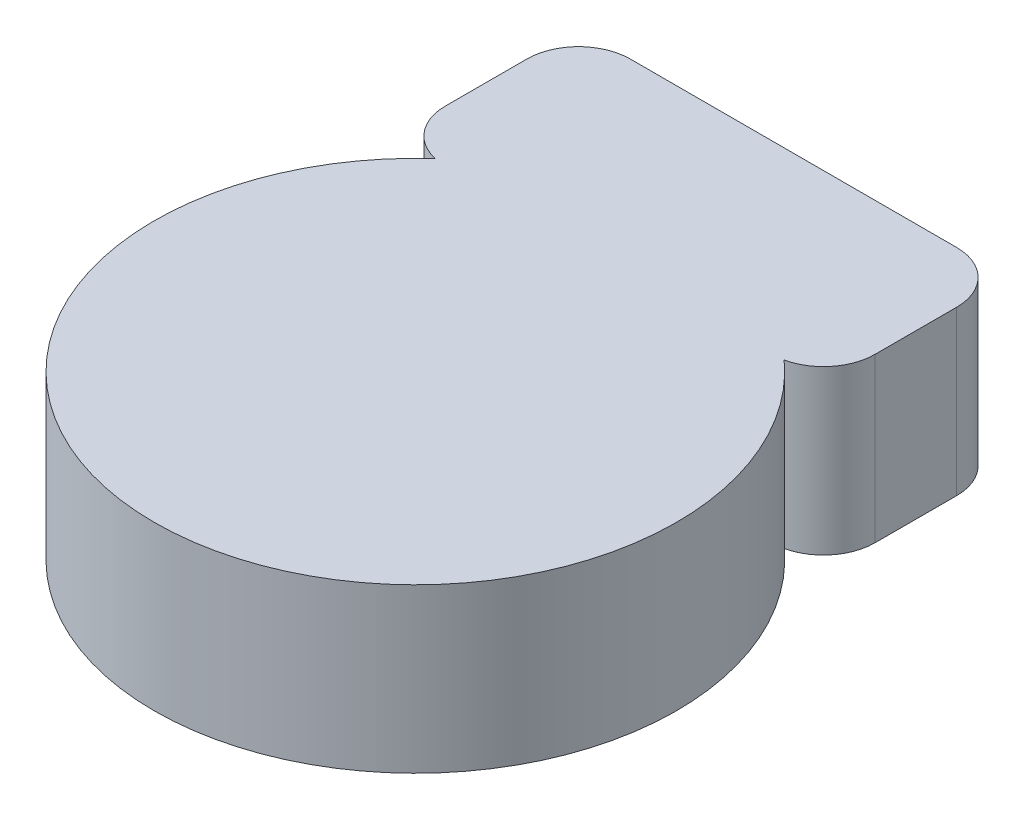
ISO-10303-21;
HEADER;
FILE_DESCRIPTION(('STEP AP214'),'2;1');
FILE_NAME('part.step','',(''),(''),'','','');
FILE_SCHEMA(('AUTOMOTIVE_DESIGN { 1 0 10303 214 1 1 1 1 }'));
ENDSEC;
DATA;
#1=APPLICATION_CONTEXT('core data for automotive mechanical design processes');
#2=APPLICATION_PROTOCOL_DEFINITION('international standard','automotive_design',2000,#1);
#3=PRODUCT_CONTEXT('',#1,'mechanical');
#4=PRODUCT('Part','Part','',(#3));
#5=PRODUCT_RELATED_PRODUCT_CATEGORY('part','',(#4));
#6=PRODUCT_DEFINITION_FORMATION('','',#4);
#7=PRODUCT_DEFINITION_CONTEXT('part definition',#1,'design');
#8=PRODUCT_DEFINITION('design','',#6,#7);
#9=PRODUCT_DEFINITION_SHAPE('','',#8);
#10=(LENGTH_UNIT() NAMED_UNIT(*) SI_UNIT(.MILLI.,.METRE.));
#11=(NAMED_UNIT(*) PLANE_ANGLE_UNIT() SI_UNIT($,.RADIAN.));
#12=(NAMED_UNIT(*) SI_UNIT($,.STERADIAN.) SOLID_ANGLE_UNIT());
#13=UNCERTAINTY_MEASURE_WITH_UNIT(LENGTH_MEASURE(1.E-05),#10,'distance_accuracy_value','');
#14=(GEOMETRIC_REPRESENTATION_CONTEXT(3) GLOBAL_UNCERTAINTY_ASSIGNED_CONTEXT((#13)) GLOBAL_UNIT_ASSIGNED_CONTEXT((#10,
#11,#12)) REPRESENTATION_CONTEXT('',''));
#15=CARTESIAN_POINT('',(0.,0.,0.));
#16=DIRECTION('',(0.,0.,1.));
#17=DIRECTION('',(1.,0.,0.));
#18=AXIS2_PLACEMENT_3D('',#15,#16,#17);
#19=CARTESIAN_POINT('',(-6.,73.4,-9.));
#20=DIRECTION('',(0.,1.,0.));
#21=DIRECTION('',(1.,0.,0.));
#22=AXIS2_PLACEMENT_3D('',#19,#20,#21);
#23=PLANE('',#22);
#24=CARTESIAN_POINT('',(-6.,73.4,-9.));
#25=DIRECTION('',(0.,1.,0.));
#26=DIRECTION('',(0.,0.,1.));
#27=AXIS2_PLACEMENT_3D('',#24,#25,#26);
#28=CIRCLE('',#27,1.9);
#29=CARTESIAN_POINT('',(-7.9,73.4,-9.));
#30=VERTEX_POINT('',#29);
#31=CARTESIAN_POINT('',(-6.41151667366118,73.4,-7.14509999533699));
#32=VERTEX_POINT('',#31);
#33=EDGE_CURVE('E164',#30,#32,#28,.T.);
#34=ORIENTED_EDGE('',*,*,#33,.T.);
#35=CARTESIAN_POINT('',(0.,73.4,0.));
#36=DIRECTION('',(0.,1.,0.));
#37=DIRECTION('',(0.,0.,1.));
#38=AXIS2_PLACEMENT_3D('',#35,#36,#37);
#39=CIRCLE('',#38,9.6);
#40=CARTESIAN_POINT('',(6.41151667366118,73.4,-7.14509999533699));
#41=VERTEX_POINT('',#40);
#42=EDGE_CURVE('E232',#32,#41,#39,.T.);
#43=ORIENTED_EDGE('',*,*,#42,.T.);
#44=CARTESIAN_POINT('',(6.,73.4,-9.));
#45=DIRECTION('',(0.,1.,0.));
#46=DIRECTION('',(0.,0.,1.));
#47=AXIS2_PLACEMENT_3D('',#44,#45,#46);
#48=CIRCLE('',#47,1.9);
#49=CARTESIAN_POINT('',(7.9,73.4,-9.));
#50=VERTEX_POINT('',#49);
#51=EDGE_CURVE('E27',#41,#50,#48,.T.);
#52=ORIENTED_EDGE('',*,*,#51,.T.);
#53=DIRECTION('',(0.,0.,-1.));
#54=VECTOR('',#53,1.);
#55=CARTESIAN_POINT('',(7.9,73.4,-9.));
#56=LINE('',#55,#54);
#57=CARTESIAN_POINT('',(7.9,73.4,-12.));
#58=VERTEX_POINT('',#57);
#59=EDGE_CURVE('E168',#50,#58,#56,.T.);
#60=ORIENTED_EDGE('',*,*,#59,.T.);
#61=CARTESIAN_POINT('',(6.,73.4,-12.));
#62=DIRECTION('',(0.,1.,0.));
#63=DIRECTION('',(0.,0.,1.));
#64=AXIS2_PLACEMENT_3D('',#61,#62,#63);
#65=CIRCLE('',#64,1.9);
#66=CARTESIAN_POINT('',(6.,73.4,-13.9));
#67=VERTEX_POINT('',#66);
#68=EDGE_CURVE('E105',#58,#67,#65,.T.);
#69=ORIENTED_EDGE('',*,*,#68,.T.);
#70=DIRECTION('',(-1.,0.,0.));
#71=VECTOR('',#70,1.);
#72=CARTESIAN_POINT('',(6.,73.4,-13.9));
#73=LINE('',#72,#71);
#74=CARTESIAN_POINT('',(-6.,73.4,-13.9));
#75=VERTEX_POINT('',#74);
#76=EDGE_CURVE('E99',#67,#75,#73,.T.);
#77=ORIENTED_EDGE('',*,*,#76,.T.);
#78=CARTESIAN_POINT('',(-6.,73.4,-12.));
#79=DIRECTION('',(0.,1.,0.));
#80=DIRECTION('',(0.,0.,1.));
#81=AXIS2_PLACEMENT_3D('',#78,#79,#80);
#82=CIRCLE('',#81,1.9);
#83=CARTESIAN_POINT('',(-7.9,73.4,-12.));
#84=VERTEX_POINT('',#83);
#85=EDGE_CURVE('E102',#75,#84,#82,.T.);
#86=ORIENTED_EDGE('',*,*,#85,.T.);
#87=DIRECTION('',(0.,0.,1.));
#88=VECTOR('',#87,1.);
#89=CARTESIAN_POINT('',(-7.9,73.4,-12.));
#90=LINE('',#89,#88);
#91=EDGE_CURVE('E153',#84,#30,#90,.T.);
#92=ORIENTED_EDGE('',*,*,#91,.T.);
#93=EDGE_LOOP('',(#34,#43,#52,#60,#69,#77,#86,#92));
#94=FACE_BOUND('',#93,.T.);
#95=ADVANCED_FACE('F16',(#94),#23,.T.);
#96=CARTESIAN_POINT('',(-6.,67.4,-9.));
#97=DIRECTION('',(0.,1.,0.));
#98=DIRECTION('',(1.,0.,0.));
#99=AXIS2_PLACEMENT_3D('',#96,#97,#98);
#100=PLANE('',#99);
#101=CARTESIAN_POINT('',(-6.,67.4,-9.));
#102=DIRECTION('',(0.,1.,0.));
#103=DIRECTION('',(0.,0.,1.));
#104=AXIS2_PLACEMENT_3D('',#101,#102,#103);
#105=CIRCLE('',#104,1.9);
#106=CARTESIAN_POINT('',(-7.9,67.4,-9.));
#107=VERTEX_POINT('',#106);
#108=CARTESIAN_POINT('',(-6.41151667366118,67.4,-7.14509999533699));
#109=VERTEX_POINT('',#108);
#110=EDGE_CURVE('E163',#107,#109,#105,.T.);
#111=ORIENTED_EDGE('',*,*,#110,.F.);
#112=DIRECTION('',(0.,0.,1.));
#113=VECTOR('',#112,1.);
#114=CARTESIAN_POINT('',(-7.9,67.4,-12.));
#115=LINE('',#114,#113);
#116=CARTESIAN_POINT('',(-7.9,67.4,-12.));
#117=VERTEX_POINT('',#116);
#118=EDGE_CURVE('E126',#117,#107,#115,.T.);
#119=ORIENTED_EDGE('',*,*,#118,.F.);
#120=CARTESIAN_POINT('',(-6.,67.4,-12.));
#121=DIRECTION('',(0.,1.,0.));
#122=DIRECTION('',(0.,0.,1.));
#123=AXIS2_PLACEMENT_3D('',#120,#121,#122);
#124=CIRCLE('',#123,1.9);
#125=CARTESIAN_POINT('',(-6.,67.4,-13.9));
#126=VERTEX_POINT('',#125);
#127=EDGE_CURVE('E20',#126,#117,#124,.T.);
#128=ORIENTED_EDGE('',*,*,#127,.F.);
#129=DIRECTION('',(-1.,0.,0.));
#130=VECTOR('',#129,1.);
#131=CARTESIAN_POINT('',(6.,67.4,-13.9));
#132=LINE('',#131,#130);
#133=CARTESIAN_POINT('',(6.,67.4,-13.9));
#134=VERTEX_POINT('',#133);
#135=EDGE_CURVE('E116',#134,#126,#132,.T.);
#136=ORIENTED_EDGE('',*,*,#135,.F.);
#137=CARTESIAN_POINT('',(6.,67.4,-12.));
#138=DIRECTION('',(0.,1.,0.));
#139=DIRECTION('',(0.,0.,1.));
#140=AXIS2_PLACEMENT_3D('',#137,#138,#139);
#141=CIRCLE('',#140,1.9);
#142=CARTESIAN_POINT('',(7.9,67.4,-12.));
#143=VERTEX_POINT('',#142);
#144=EDGE_CURVE('E165',#143,#134,#141,.T.);
#145=ORIENTED_EDGE('',*,*,#144,.F.);
#146=DIRECTION('',(0.,0.,-1.));
#147=VECTOR('',#146,1.);
#148=CARTESIAN_POINT('',(7.9,67.4,-9.));
#149=LINE('',#148,#147);
#150=CARTESIAN_POINT('',(7.9,67.4,-9.));
#151=VERTEX_POINT('',#150);
#152=EDGE_CURVE('E136',#151,#143,#149,.T.);
#153=ORIENTED_EDGE('',*,*,#152,.F.);
#154=CARTESIAN_POINT('',(6.,67.4,-9.));
#155=DIRECTION('',(0.,1.,0.));
#156=DIRECTION('',(0.,0.,1.));
#157=AXIS2_PLACEMENT_3D('',#154,#155,#156);
#158=CIRCLE('',#157,1.9);
#159=CARTESIAN_POINT('',(6.41151667366118,67.4,-7.14509999533699));
#160=VERTEX_POINT('',#159);
#161=EDGE_CURVE('E11',#160,#151,#158,.T.);
#162=ORIENTED_EDGE('',*,*,#161,.F.);
#163=CARTESIAN_POINT('',(0.,67.4,0.));
#164=DIRECTION('',(0.,1.,0.));
#165=DIRECTION('',(0.,0.,1.));
#166=AXIS2_PLACEMENT_3D('',#163,#164,#165);
#167=CIRCLE('',#166,9.6);
#168=EDGE_CURVE('E155',#109,#160,#167,.T.);
#169=ORIENTED_EDGE('',*,*,#168,.F.);
#170=EDGE_LOOP('',(#111,#119,#128,#136,#145,#153,#162,#169));
#171=FACE_BOUND('',#170,.T.);
#172=ADVANCED_FACE('F198',(#171),#100,.F.);
#173=CARTESIAN_POINT('',(6.,67.4,-9.));
#174=DIRECTION('',(0.,1.,0.));
#175=DIRECTION('',(0.,0.,1.));
#176=AXIS2_PLACEMENT_3D('',#173,#174,#175);
#177=CYLINDRICAL_SURFACE('',#176,1.9);
#178=ORIENTED_EDGE('',*,*,#51,.F.);
#179=DIRECTION('',(0.,1.,0.));
#180=VECTOR('',#179,1.);
#181=CARTESIAN_POINT('',(6.41151667366118,67.4,-7.14509999533699));
#182=LINE('',#181,#180);
#183=EDGE_CURVE('E158',#160,#41,#182,.T.);
#184=ORIENTED_EDGE('',*,*,#183,.F.);
#185=ORIENTED_EDGE('',*,*,#161,.T.);
#186=DIRECTION('',(0.,1.,0.));
#187=VECTOR('',#186,1.);
#188=CARTESIAN_POINT('',(7.9,67.4,-9.));
#189=LINE('',#188,#187);
#190=EDGE_CURVE('E169',#151,#50,#189,.T.);
#191=ORIENTED_EDGE('',*,*,#190,.T.);
#192=EDGE_LOOP('',(#178,#184,#185,#191));
#193=FACE_BOUND('',#192,.T.);
#194=ADVANCED_FACE('F195',(#193),#177,.T.);
#195=CARTESIAN_POINT('',(7.9,67.4,-9.));
#196=DIRECTION('',(1.,0.,0.));
#197=DIRECTION('',(0.,1.,0.));
#198=AXIS2_PLACEMENT_3D('',#195,#196,#197);
#199=PLANE('',#198);
#200=ORIENTED_EDGE('',*,*,#59,.F.);
#201=ORIENTED_EDGE('',*,*,#190,.F.);
#202=ORIENTED_EDGE('',*,*,#152,.T.);
#203=DIRECTION('',(0.,1.,0.));
#204=VECTOR('',#203,1.);
#205=CARTESIAN_POINT('',(7.9,67.4,-12.));
#206=LINE('',#205,#204);
#207=EDGE_CURVE('E142',#143,#58,#206,.T.);
#208=ORIENTED_EDGE('',*,*,#207,.T.);
#209=EDGE_LOOP('',(#200,#201,#202,#208));
#210=FACE_BOUND('',#209,.T.);
#211=ADVANCED_FACE('F184',(#210),#199,.T.);
#212=CARTESIAN_POINT('',(6.,67.4,-12.));
#213=DIRECTION('',(0.,1.,0.));
#214=DIRECTION('',(0.,0.,1.));
#215=AXIS2_PLACEMENT_3D('',#212,#213,#214);
#216=CYLINDRICAL_SURFACE('',#215,1.9);
#217=ORIENTED_EDGE('',*,*,#68,.F.);
#218=ORIENTED_EDGE('',*,*,#207,.F.);
#219=ORIENTED_EDGE('',*,*,#144,.T.);
#220=DIRECTION('',(0.,1.,0.));
#221=VECTOR('',#220,1.);
#222=CARTESIAN_POINT('',(6.,67.4,-13.9));
#223=LINE('',#222,#221);
#224=EDGE_CURVE('E110',#134,#67,#223,.T.);
#225=ORIENTED_EDGE('',*,*,#224,.T.);
#226=EDGE_LOOP('',(#217,#218,#219,#225));
#227=FACE_BOUND('',#226,.T.);
#228=ADVANCED_FACE('F18',(#227),#216,.T.);
#229=CARTESIAN_POINT('',(6.,67.4,-13.9));
#230=DIRECTION('',(0.,0.,-1.));
#231=DIRECTION('',(0.,-1.,0.));
#232=AXIS2_PLACEMENT_3D('',#229,#230,#231);
#233=PLANE('',#232);
#234=ORIENTED_EDGE('',*,*,#76,.F.);
#235=ORIENTED_EDGE('',*,*,#224,.F.);
#236=ORIENTED_EDGE('',*,*,#135,.T.);
#237=DIRECTION('',(0.,1.,0.));
#238=VECTOR('',#237,1.);
#239=CARTESIAN_POINT('',(-6.,67.4,-13.9));
#240=LINE('',#239,#238);
#241=EDGE_CURVE('E113',#126,#75,#240,.T.);
#242=ORIENTED_EDGE('',*,*,#241,.T.);
#243=EDGE_LOOP('',(#234,#235,#236,#242));
#244=FACE_BOUND('',#243,.T.);
#245=ADVANCED_FACE('F114',(#244),#233,.T.);
#246=CARTESIAN_POINT('',(-6.,67.4,-12.));
#247=DIRECTION('',(0.,1.,0.));
#248=DIRECTION('',(0.,0.,1.));
#249=AXIS2_PLACEMENT_3D('',#246,#247,#248);
#250=CYLINDRICAL_SURFACE('',#249,1.9);
#251=ORIENTED_EDGE('',*,*,#85,.F.);
#252=ORIENTED_EDGE('',*,*,#241,.F.);
#253=ORIENTED_EDGE('',*,*,#127,.T.);
#254=DIRECTION('',(0.,1.,0.));
#255=VECTOR('',#254,1.);
#256=CARTESIAN_POINT('',(-7.9,67.4,-12.));
#257=LINE('',#256,#255);
#258=EDGE_CURVE('E123',#117,#84,#257,.T.);
#259=ORIENTED_EDGE('',*,*,#258,.T.);
#260=EDGE_LOOP('',(#251,#252,#253,#259));
#261=FACE_BOUND('',#260,.T.);
#262=ADVANCED_FACE('F121',(#261),#250,.T.);
#263=CARTESIAN_POINT('',(-7.9,67.4,-12.));
#264=DIRECTION('',(-1.,0.,0.));
#265=DIRECTION('',(0.,1.,0.));
#266=AXIS2_PLACEMENT_3D('',#263,#264,#265);
#267=PLANE('',#266);
#268=ORIENTED_EDGE('',*,*,#91,.F.);
#269=ORIENTED_EDGE('',*,*,#258,.F.);
#270=ORIENTED_EDGE('',*,*,#118,.T.);
#271=DIRECTION('',(0.,1.,0.));
#272=VECTOR('',#271,1.);
#273=CARTESIAN_POINT('',(-7.9,67.4,-9.));
#274=LINE('',#273,#272);
#275=EDGE_CURVE('E159',#107,#30,#274,.T.);
#276=ORIENTED_EDGE('',*,*,#275,.T.);
#277=EDGE_LOOP('',(#268,#269,#270,#276));
#278=FACE_BOUND('',#277,.T.);
#279=ADVANCED_FACE('F209',(#278),#267,.T.);
#280=CARTESIAN_POINT('',(-6.,67.4,-9.));
#281=DIRECTION('',(0.,1.,0.));
#282=DIRECTION('',(0.,0.,1.));
#283=AXIS2_PLACEMENT_3D('',#280,#281,#282);
#284=CYLINDRICAL_SURFACE('',#283,1.9);
#285=ORIENTED_EDGE('',*,*,#33,.F.);
#286=ORIENTED_EDGE('',*,*,#275,.F.);
#287=ORIENTED_EDGE('',*,*,#110,.T.);
#288=DIRECTION('',(0.,1.,0.));
#289=VECTOR('',#288,1.);
#290=CARTESIAN_POINT('',(-6.41151667366118,67.4,-7.14509999533699));
#291=LINE('',#290,#289);
#292=EDGE_CURVE('E227',#109,#32,#291,.T.);
#293=ORIENTED_EDGE('',*,*,#292,.T.);
#294=EDGE_LOOP('',(#285,#286,#287,#293));
#295=FACE_BOUND('',#294,.T.);
#296=ADVANCED_FACE('F210',(#295),#284,.T.);
#297=CARTESIAN_POINT('',(0.,67.4,0.));
#298=DIRECTION('',(0.,1.,0.));
#299=DIRECTION('',(0.,0.,1.));
#300=AXIS2_PLACEMENT_3D('',#297,#298,#299);
#301=CYLINDRICAL_SURFACE('',#300,9.6);
#302=ORIENTED_EDGE('',*,*,#168,.T.);
#303=ORIENTED_EDGE('',*,*,#183,.T.);
#304=ORIENTED_EDGE('',*,*,#42,.F.);
#305=ORIENTED_EDGE('',*,*,#292,.F.);
#306=EDGE_LOOP('',(#302,#303,#304,#305));
#307=FACE_BOUND('',#306,.T.);
#308=ADVANCED_FACE('F212',(#307),#301,.T.);
#309=CLOSED_SHELL('',(#95,#172,#194,#211,#228,#245,#262,#279,#296,#308));
#310=MANIFOLD_SOLID_BREP('B1',#309);
#311=ADVANCED_BREP_SHAPE_REPRESENTATION('',(#18,#310),#14);
#312=SHAPE_DEFINITION_REPRESENTATION(#9,#311);
ENDSEC;
END-ISO-10303-21;
